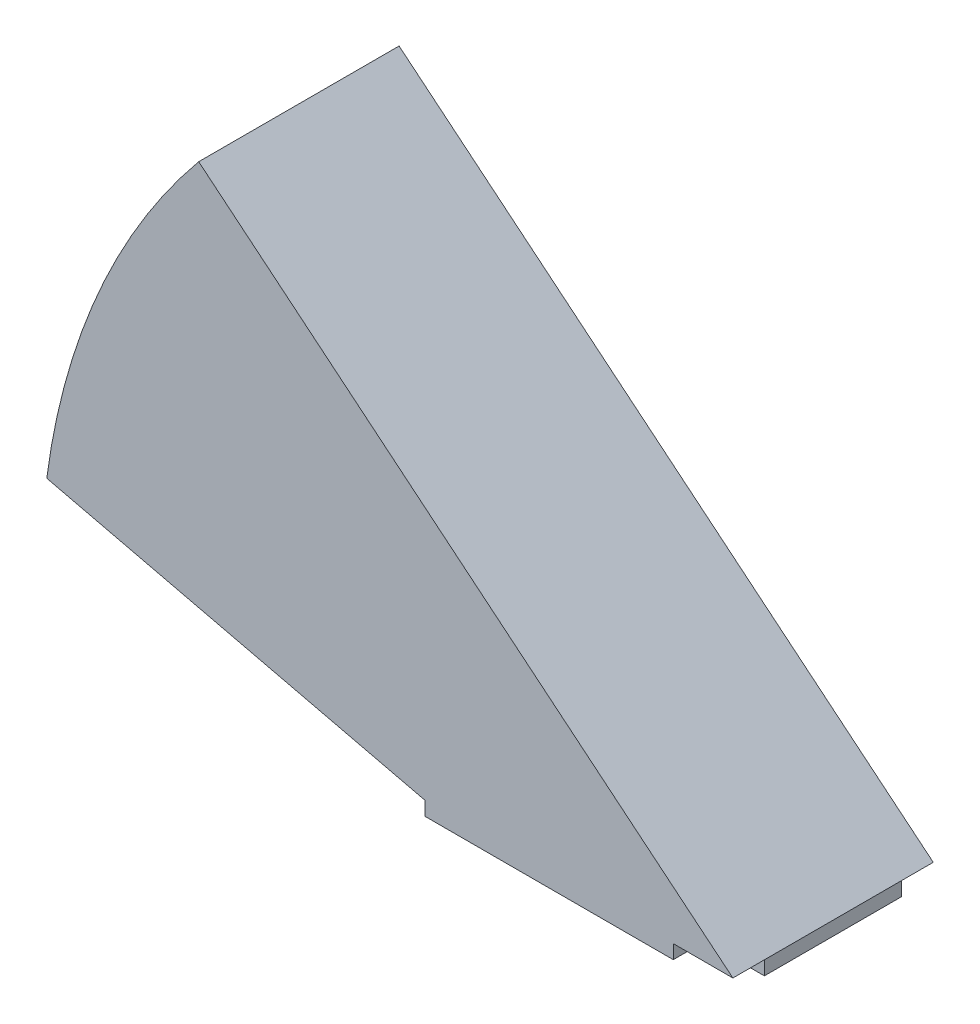
ISO-10303-21;
HEADER;
FILE_DESCRIPTION(('STEP AP214'),'2;1');
FILE_NAME('part.step','',(''),(''),'','','');
FILE_SCHEMA(('AUTOMOTIVE_DESIGN { 1 0 10303 214 1 1 1 1 }'));
ENDSEC;
DATA;
#1=APPLICATION_CONTEXT('core data for automotive mechanical design processes');
#2=APPLICATION_PROTOCOL_DEFINITION('international standard','automotive_design',2000,#1);
#3=PRODUCT_CONTEXT('',#1,'mechanical');
#4=PRODUCT('Part','Part','',(#3));
#5=PRODUCT_RELATED_PRODUCT_CATEGORY('part','',(#4));
#6=PRODUCT_DEFINITION_FORMATION('','',#4);
#7=PRODUCT_DEFINITION_CONTEXT('part definition',#1,'design');
#8=PRODUCT_DEFINITION('design','',#6,#7);
#9=PRODUCT_DEFINITION_SHAPE('','',#8);
#10=(LENGTH_UNIT() NAMED_UNIT(*) SI_UNIT(.MILLI.,.METRE.));
#11=(NAMED_UNIT(*) PLANE_ANGLE_UNIT() SI_UNIT($,.RADIAN.));
#12=(NAMED_UNIT(*) SI_UNIT($,.STERADIAN.) SOLID_ANGLE_UNIT());
#13=UNCERTAINTY_MEASURE_WITH_UNIT(LENGTH_MEASURE(1.E-05),#10,'distance_accuracy_value','');
#14=(GEOMETRIC_REPRESENTATION_CONTEXT(3) GLOBAL_UNCERTAINTY_ASSIGNED_CONTEXT((#13)) GLOBAL_UNIT_ASSIGNED_CONTEXT((#10,
#11,#12)) REPRESENTATION_CONTEXT('',''));
#15=CARTESIAN_POINT('',(0.,0.,0.));
#16=DIRECTION('',(0.,0.,1.));
#17=DIRECTION('',(1.,0.,0.));
#18=AXIS2_PLACEMENT_3D('',#15,#16,#17);
#19=CARTESIAN_POINT('',(71.3,4.,0.));
#20=DIRECTION('',(-1.,0.,0.));
#21=DIRECTION('',(0.,0.,1.));
#22=AXIS2_PLACEMENT_3D('',#19,#20,#21);
#23=PLANE('',#22);
#24=DIRECTION('',(0.,0.,-1.));
#25=VECTOR('',#24,1.);
#26=CARTESIAN_POINT('',(71.3,0.,0.));
#27=LINE('',#26,#25);
#28=CARTESIAN_POINT('',(71.3,0.,0.));
#29=VERTEX_POINT('',#28);
#30=CARTESIAN_POINT('',(71.3,0.,-9.05));
#31=VERTEX_POINT('',#30);
#32=EDGE_CURVE('E195',#29,#31,#27,.T.);
#33=ORIENTED_EDGE('',*,*,#32,.T.);
#34=DIRECTION('',(0.,-1.,0.));
#35=VECTOR('',#34,1.);
#36=CARTESIAN_POINT('',(71.3,4.,-9.05));
#37=LINE('',#36,#35);
#38=CARTESIAN_POINT('',(71.3,4.,-9.05));
#39=VERTEX_POINT('',#38);
#40=EDGE_CURVE('E11',#39,#31,#37,.T.);
#41=ORIENTED_EDGE('',*,*,#40,.F.);
#42=DIRECTION('',(0.,0.,-1.));
#43=VECTOR('',#42,1.);
#44=CARTESIAN_POINT('',(71.3,4.,0.));
#45=LINE('',#44,#43);
#46=CARTESIAN_POINT('',(71.3,4.,0.));
#47=VERTEX_POINT('',#46);
#48=EDGE_CURVE('E176',#47,#39,#45,.T.);
#49=ORIENTED_EDGE('',*,*,#48,.F.);
#50=DIRECTION('',(0.,-1.,0.));
#51=VECTOR('',#50,1.);
#52=CARTESIAN_POINT('',(71.3,4.,0.));
#53=LINE('',#52,#51);
#54=EDGE_CURVE('E65',#47,#29,#53,.T.);
#55=ORIENTED_EDGE('',*,*,#54,.T.);
#56=EDGE_LOOP('',(#33,#41,#49,#55));
#57=FACE_BOUND('',#56,.T.);
#58=ADVANCED_FACE('F47',(#57),#23,.F.);
#59=CARTESIAN_POINT('',(0.,4.,-9.05));
#60=DIRECTION('',(0.,0.,-1.));
#61=DIRECTION('',(-1.,0.,0.));
#62=AXIS2_PLACEMENT_3D('',#59,#60,#61);
#63=PLANE('',#62);
#64=DIRECTION('',(1.,0.,0.));
#65=VECTOR('',#64,1.);
#66=CARTESIAN_POINT('',(0.,0.,-9.05));
#67=LINE('',#66,#65);
#68=CARTESIAN_POINT('',(88.4,0.,-9.05));
#69=VERTEX_POINT('',#68);
#70=EDGE_CURVE('E202',#31,#69,#67,.T.);
#71=ORIENTED_EDGE('',*,*,#70,.T.);
#72=DIRECTION('',(0.,-1.,0.));
#73=VECTOR('',#72,1.);
#74=CARTESIAN_POINT('',(88.4,4.,-9.05));
#75=LINE('',#74,#73);
#76=CARTESIAN_POINT('',(88.4,4.,-9.05));
#77=VERTEX_POINT('',#76);
#78=EDGE_CURVE('E57',#77,#69,#75,.T.);
#79=ORIENTED_EDGE('',*,*,#78,.F.);
#80=DIRECTION('',(1.,0.,0.));
#81=VECTOR('',#80,1.);
#82=CARTESIAN_POINT('',(0.,4.,-9.05));
#83=LINE('',#82,#81);
#84=EDGE_CURVE('E103',#39,#77,#83,.T.);
#85=ORIENTED_EDGE('',*,*,#84,.F.);
#86=ORIENTED_EDGE('',*,*,#40,.T.);
#87=EDGE_LOOP('',(#71,#79,#85,#86));
#88=FACE_BOUND('',#87,.T.);
#89=ADVANCED_FACE('F49',(#88),#63,.F.);
#90=CARTESIAN_POINT('',(88.4,4.,0.));
#91=DIRECTION('',(1.,0.,0.));
#92=DIRECTION('',(0.,0.,-1.));
#93=AXIS2_PLACEMENT_3D('',#90,#91,#92);
#94=PLANE('',#93);
#95=DIRECTION('',(0.,0.,1.));
#96=VECTOR('',#95,1.);
#97=CARTESIAN_POINT('',(88.4,0.,0.));
#98=LINE('',#97,#96);
#99=CARTESIAN_POINT('',(88.4,0.,-48.45));
#100=VERTEX_POINT('',#99);
#101=EDGE_CURVE('E207',#100,#69,#98,.T.);
#102=ORIENTED_EDGE('',*,*,#101,.F.);
#103=DIRECTION('',(0.,-1.,0.));
#104=VECTOR('',#103,1.);
#105=CARTESIAN_POINT('',(88.4,4.,-48.45));
#106=LINE('',#105,#104);
#107=CARTESIAN_POINT('',(88.4,4.,-48.45));
#108=VERTEX_POINT('',#107);
#109=EDGE_CURVE('E238',#108,#100,#106,.T.);
#110=ORIENTED_EDGE('',*,*,#109,.F.);
#111=DIRECTION('',(0.,0.,1.));
#112=VECTOR('',#111,1.);
#113=CARTESIAN_POINT('',(88.4,4.,0.));
#114=LINE('',#113,#112);
#115=EDGE_CURVE('E183',#108,#77,#114,.T.);
#116=ORIENTED_EDGE('',*,*,#115,.T.);
#117=ORIENTED_EDGE('',*,*,#78,.T.);
#118=EDGE_LOOP('',(#102,#110,#116,#117));
#119=FACE_BOUND('',#118,.T.);
#120=ADVANCED_FACE('F243',(#119),#94,.T.);
#121=CARTESIAN_POINT('',(0.,4.,-48.45));
#122=DIRECTION('',(0.,0.,-1.));
#123=DIRECTION('',(-1.,0.,0.));
#124=AXIS2_PLACEMENT_3D('',#121,#122,#123);
#125=PLANE('',#124);
#126=DIRECTION('',(1.,0.,0.));
#127=VECTOR('',#126,1.);
#128=CARTESIAN_POINT('',(0.,0.,-48.45));
#129=LINE('',#128,#127);
#130=CARTESIAN_POINT('',(71.3,0.,-48.45));
#131=VERTEX_POINT('',#130);
#132=EDGE_CURVE('E211',#131,#100,#129,.T.);
#133=ORIENTED_EDGE('',*,*,#132,.F.);
#134=DIRECTION('',(0.,-1.,0.));
#135=VECTOR('',#134,1.);
#136=CARTESIAN_POINT('',(71.3,4.,-48.45));
#137=LINE('',#136,#135);
#138=CARTESIAN_POINT('',(71.3,4.,-48.45));
#139=VERTEX_POINT('',#138);
#140=EDGE_CURVE('E235',#139,#131,#137,.T.);
#141=ORIENTED_EDGE('',*,*,#140,.F.);
#142=DIRECTION('',(1.,0.,0.));
#143=VECTOR('',#142,1.);
#144=CARTESIAN_POINT('',(0.,4.,-48.45));
#145=LINE('',#144,#143);
#146=EDGE_CURVE('E187',#139,#108,#145,.T.);
#147=ORIENTED_EDGE('',*,*,#146,.T.);
#148=ORIENTED_EDGE('',*,*,#109,.T.);
#149=EDGE_LOOP('',(#133,#141,#147,#148));
#150=FACE_BOUND('',#149,.T.);
#151=ADVANCED_FACE('F253',(#150),#125,.T.);
#152=CARTESIAN_POINT('',(71.3,0.,-57.5));
#153=VERTEX_POINT('',#152);
#154=EDGE_CURVE('E203',#131,#153,#27,.T.);
#155=ORIENTED_EDGE('',*,*,#154,.T.);
#156=DIRECTION('',(0.,-1.,0.));
#157=VECTOR('',#156,1.);
#158=CARTESIAN_POINT('',(71.3,4.,-57.5));
#159=LINE('',#158,#157);
#160=CARTESIAN_POINT('',(71.3,4.,-57.5));
#161=VERTEX_POINT('',#160);
#162=EDGE_CURVE('E132',#161,#153,#159,.T.);
#163=ORIENTED_EDGE('',*,*,#162,.F.);
#164=EDGE_CURVE('E141',#139,#161,#45,.T.);
#165=ORIENTED_EDGE('',*,*,#164,.F.);
#166=ORIENTED_EDGE('',*,*,#140,.T.);
#167=EDGE_LOOP('',(#155,#163,#165,#166));
#168=FACE_BOUND('',#167,.T.);
#169=ADVANCED_FACE('F286',(#168),#23,.F.);
#170=CARTESIAN_POINT('',(0.,4.,-57.5));
#171=DIRECTION('',(0.,0.,-1.));
#172=DIRECTION('',(-1.,0.,0.));
#173=AXIS2_PLACEMENT_3D('',#170,#171,#172);
#174=PLANE('',#173);
#175=DIRECTION('',(1.,0.,0.));
#176=VECTOR('',#175,1.);
#177=CARTESIAN_POINT('',(0.,0.,-57.5));
#178=LINE('',#177,#176);
#179=CARTESIAN_POINT('',(0.,0.,-57.5));
#180=VERTEX_POINT('',#179);
#181=EDGE_CURVE('E127',#180,#153,#178,.T.);
#182=ORIENTED_EDGE('',*,*,#181,.F.);
#183=DIRECTION('',(0.,-1.,0.));
#184=VECTOR('',#183,1.);
#185=CARTESIAN_POINT('',(0.,4.,-57.5));
#186=LINE('',#185,#184);
#187=CARTESIAN_POINT('',(0.,4.,-57.5));
#188=VERTEX_POINT('',#187);
#189=EDGE_CURVE('E118',#188,#180,#186,.T.);
#190=ORIENTED_EDGE('',*,*,#189,.F.);
#191=DIRECTION('',(-0.972973897150185,0.230915126105635,0.));
#192=VECTOR('',#191,1.);
#193=CARTESIAN_POINT('',(0.898697560631704,3.78671281814248,-57.5));
#194=LINE('',#193,#192);
#195=CARTESIAN_POINT('',(-108.484737296256,29.7465969710746,-57.5));
#196=VERTEX_POINT('',#195);
#197=EDGE_CURVE('E124',#188,#196,#194,.T.);
#198=ORIENTED_EDGE('',*,*,#197,.T.);
#199=CARTESIAN_POINT('',(88.4,4.,-57.5));
#200=DIRECTION('',(0.,0.,-1.));
#201=DIRECTION('',(-1.,0.,0.));
#202=AXIS2_PLACEMENT_3D('',#199,#200,#201);
#203=CIRCLE('',#202,198.561041082602);
#204=CARTESIAN_POINT('',(-64.8786864319716,130.22254680324,-57.5));
#205=VERTEX_POINT('',#204);
#206=EDGE_CURVE('E157',#205,#196,#203,.F.);
#207=ORIENTED_EDGE('',*,*,#206,.F.);
#208=DIRECTION('',(-0.77194743538944,0.635686366847416,0.));
#209=VECTOR('',#208,1.);
#210=CARTESIAN_POINT('',(37.6850545208165,45.7629464890479,-57.5));
#211=LINE('',#210,#209);
#212=CARTESIAN_POINT('',(88.4,3.99999999999999,-57.5));
#213=VERTEX_POINT('',#212);
#214=EDGE_CURVE('E161',#213,#205,#211,.T.);
#215=ORIENTED_EDGE('',*,*,#214,.F.);
#216=DIRECTION('',(1.,0.,0.));
#217=VECTOR('',#216,1.);
#218=CARTESIAN_POINT('',(0.,4.,-57.5));
#219=LINE('',#218,#217);
#220=EDGE_CURVE('E155',#161,#213,#219,.T.);
#221=ORIENTED_EDGE('',*,*,#220,.F.);
#222=ORIENTED_EDGE('',*,*,#162,.T.);
#223=EDGE_LOOP('',(#182,#190,#198,#207,#215,#221,#222));
#224=FACE_BOUND('',#223,.T.);
#225=ADVANCED_FACE('F120',(#224),#174,.T.);
#226=CARTESIAN_POINT('',(0.,4.,0.));
#227=DIRECTION('',(-1.,0.,0.));
#228=DIRECTION('',(0.,0.,1.));
#229=AXIS2_PLACEMENT_3D('',#226,#227,#228);
#230=PLANE('',#229);
#231=DIRECTION('',(0.,0.,-1.));
#232=VECTOR('',#231,1.);
#233=CARTESIAN_POINT('',(0.,0.,0.));
#234=LINE('',#233,#232);
#235=CARTESIAN_POINT('',(0.,0.,0.));
#236=VERTEX_POINT('',#235);
#237=EDGE_CURVE('E217',#236,#180,#234,.T.);
#238=ORIENTED_EDGE('',*,*,#237,.F.);
#239=DIRECTION('',(0.,-1.,0.));
#240=VECTOR('',#239,1.);
#241=CARTESIAN_POINT('',(0.,4.,0.));
#242=LINE('',#241,#240);
#243=CARTESIAN_POINT('',(0.,4.,0.));
#244=VERTEX_POINT('',#243);
#245=EDGE_CURVE('E93',#244,#236,#242,.T.);
#246=ORIENTED_EDGE('',*,*,#245,.F.);
#247=DIRECTION('',(0.,0.,-1.));
#248=VECTOR('',#247,1.);
#249=CARTESIAN_POINT('',(0.,4.,0.));
#250=LINE('',#249,#248);
#251=EDGE_CURVE('E135',#244,#188,#250,.T.);
#252=ORIENTED_EDGE('',*,*,#251,.T.);
#253=ORIENTED_EDGE('',*,*,#189,.T.);
#254=EDGE_LOOP('',(#238,#246,#252,#253));
#255=FACE_BOUND('',#254,.T.);
#256=ADVANCED_FACE('F136',(#255),#230,.T.);
#257=CARTESIAN_POINT('',(31.9771321754663,4.,-49.7748701258488));
#258=DIRECTION('',(0.,-1.,0.));
#259=DIRECTION('',(0.,0.,-1.));
#260=AXIS2_PLACEMENT_3D('',#257,#258,#259);
#261=CYLINDRICAL_SURFACE('',#260,4.56669303705034);
#262=CARTESIAN_POINT('',(31.9771321754663,4.,-49.7748701258488));
#263=DIRECTION('',(0.,1.,0.));
#264=DIRECTION('',(0.,0.,1.));
#265=AXIS2_PLACEMENT_3D('',#262,#263,#264);
#266=CIRCLE('',#265,4.56669303705034);
#267=CARTESIAN_POINT('',(31.9771321754663,4.,-45.2081770887985));
#268=VERTEX_POINT('',#267);
#269=EDGE_CURVE('E191',#268,#268,#266,.T.);
#270=ORIENTED_EDGE('',*,*,#269,.T.);
#271=EDGE_LOOP('',(#270));
#272=FACE_BOUND('',#271,.T.);
#273=CARTESIAN_POINT('',(31.9771321754663,0.,-49.7748701258488));
#274=DIRECTION('',(0.,1.,0.));
#275=DIRECTION('',(0.,0.,1.));
#276=AXIS2_PLACEMENT_3D('',#273,#274,#275);
#277=CIRCLE('',#276,4.56669303705034);
#278=CARTESIAN_POINT('',(31.9771321754663,0.,-45.2081770887985));
#279=VERTEX_POINT('',#278);
#280=EDGE_CURVE('E222',#279,#279,#277,.T.);
#281=ORIENTED_EDGE('',*,*,#280,.F.);
#282=EDGE_LOOP('',(#281));
#283=FACE_BOUND('',#282,.T.);
#284=ADVANCED_FACE('F369',(#272,#283),#261,.F.);
#285=CARTESIAN_POINT('',(0.,4.,0.));
#286=DIRECTION('',(0.,0.,-1.));
#287=DIRECTION('',(-1.,0.,0.));
#288=AXIS2_PLACEMENT_3D('',#285,#286,#287);
#289=PLANE('',#288);
#290=DIRECTION('',(1.,0.,0.));
#291=VECTOR('',#290,1.);
#292=CARTESIAN_POINT('',(0.,0.,0.));
#293=LINE('',#292,#291);
#294=EDGE_CURVE('E96',#236,#29,#293,.T.);
#295=ORIENTED_EDGE('',*,*,#294,.T.);
#296=ORIENTED_EDGE('',*,*,#54,.F.);
#297=DIRECTION('',(1.,0.,0.));
#298=VECTOR('',#297,1.);
#299=CARTESIAN_POINT('',(0.,4.,0.));
#300=LINE('',#299,#298);
#301=CARTESIAN_POINT('',(88.4,3.99999999999999,0.));
#302=VERTEX_POINT('',#301);
#303=EDGE_CURVE('E148',#47,#302,#300,.T.);
#304=ORIENTED_EDGE('',*,*,#303,.T.);
#305=DIRECTION('',(-0.771947435389439,0.635686366847416,0.));
#306=VECTOR('',#305,1.);
#307=CARTESIAN_POINT('',(37.6850545208165,45.7629464890479,0.));
#308=LINE('',#307,#306);
#309=CARTESIAN_POINT('',(-64.8786864319716,130.22254680324,0.));
#310=VERTEX_POINT('',#309);
#311=EDGE_CURVE('E151',#302,#310,#308,.T.);
#312=ORIENTED_EDGE('',*,*,#311,.T.);
#313=CARTESIAN_POINT('',(88.4,4.,0.));
#314=DIRECTION('',(0.,0.,1.));
#315=DIRECTION('',(1.,0.,0.));
#316=AXIS2_PLACEMENT_3D('',#313,#314,#315);
#317=CIRCLE('',#316,198.561041082602);
#318=CARTESIAN_POINT('',(-108.484737296256,29.7465969710746,0.));
#319=VERTEX_POINT('',#318);
#320=EDGE_CURVE('E273',#310,#319,#317,.T.);
#321=ORIENTED_EDGE('',*,*,#320,.T.);
#322=DIRECTION('',(-0.972973897150185,0.230915126105635,0.));
#323=VECTOR('',#322,1.);
#324=CARTESIAN_POINT('',(0.898697560631704,3.78671281814248,0.));
#325=LINE('',#324,#323);
#326=EDGE_CURVE('E168',#244,#319,#325,.T.);
#327=ORIENTED_EDGE('',*,*,#326,.F.);
#328=ORIENTED_EDGE('',*,*,#245,.T.);
#329=EDGE_LOOP('',(#295,#296,#304,#312,#321,#327,#328));
#330=FACE_BOUND('',#329,.T.);
#331=ADVANCED_FACE('F292',(#330),#289,.F.);
#332=CARTESIAN_POINT('',(31.9771321754663,4.,-7.7251298741512));
#333=DIRECTION('',(0.,-1.,0.));
#334=DIRECTION('',(0.,0.,-1.));
#335=AXIS2_PLACEMENT_3D('',#332,#333,#334);
#336=CYLINDRICAL_SURFACE('',#335,4.56669303705034);
#337=CARTESIAN_POINT('',(31.9771321754663,4.,-7.7251298741512));
#338=DIRECTION('',(0.,1.,0.));
#339=DIRECTION('',(0.,0.,1.));
#340=AXIS2_PLACEMENT_3D('',#337,#338,#339);
#341=CIRCLE('',#340,4.56669303705034);
#342=CARTESIAN_POINT('',(31.9771321754663,4.,-3.15843683710086));
#343=VERTEX_POINT('',#342);
#344=EDGE_CURVE('E140',#343,#343,#341,.F.);
#345=ORIENTED_EDGE('',*,*,#344,.F.);
#346=EDGE_LOOP('',(#345));
#347=FACE_BOUND('',#346,.T.);
#348=CARTESIAN_POINT('',(31.9771321754663,0.,-7.7251298741512));
#349=DIRECTION('',(0.,1.,0.));
#350=DIRECTION('',(0.,0.,1.));
#351=AXIS2_PLACEMENT_3D('',#348,#349,#350);
#352=CIRCLE('',#351,4.56669303705034);
#353=CARTESIAN_POINT('',(31.9771321754663,0.,-3.15843683710086));
#354=VERTEX_POINT('',#353);
#355=EDGE_CURVE('E180',#354,#354,#352,.F.);
#356=ORIENTED_EDGE('',*,*,#355,.T.);
#357=EDGE_LOOP('',(#356));
#358=FACE_BOUND('',#357,.T.);
#359=ADVANCED_FACE('F385',(#347,#358),#336,.F.);
#360=CARTESIAN_POINT('',(0.,0.,0.));
#361=DIRECTION('',(0.,1.,0.));
#362=DIRECTION('',(0.,0.,1.));
#363=AXIS2_PLACEMENT_3D('',#360,#361,#362);
#364=PLANE('',#363);
#365=ORIENTED_EDGE('',*,*,#32,.F.);
#366=ORIENTED_EDGE('',*,*,#294,.F.);
#367=ORIENTED_EDGE('',*,*,#237,.T.);
#368=ORIENTED_EDGE('',*,*,#181,.T.);
#369=ORIENTED_EDGE('',*,*,#154,.F.);
#370=ORIENTED_EDGE('',*,*,#132,.T.);
#371=ORIENTED_EDGE('',*,*,#101,.T.);
#372=ORIENTED_EDGE('',*,*,#70,.F.);
#373=EDGE_LOOP('',(#365,#366,#367,#368,#369,#370,#371,#372));
#374=FACE_BOUND('',#373,.T.);
#375=ORIENTED_EDGE('',*,*,#280,.T.);
#376=EDGE_LOOP('',(#375));
#377=FACE_BOUND('',#376,.T.);
#378=ORIENTED_EDGE('',*,*,#355,.F.);
#379=EDGE_LOOP('',(#378));
#380=FACE_BOUND('',#379,.T.);
#381=ADVANCED_FACE('F247',(#374,#377,#380),#364,.F.);
#382=CARTESIAN_POINT('',(0.,4.,-291.37118484694));
#383=DIRECTION('',(0.,-1.,0.));
#384=DIRECTION('',(0.,0.,-1.));
#385=AXIS2_PLACEMENT_3D('',#382,#383,#384);
#386=PLANE('',#385);
#387=ORIENTED_EDGE('',*,*,#344,.T.);
#388=EDGE_LOOP('',(#387));
#389=FACE_BOUND('',#388,.T.);
#390=ADVANCED_FACE('F401',(#389),#386,.T.);
#391=ORIENTED_EDGE('',*,*,#269,.F.);
#392=EDGE_LOOP('',(#391));
#393=FACE_BOUND('',#392,.T.);
#394=ADVANCED_FACE('F410',(#393),#386,.T.);
#395=ORIENTED_EDGE('',*,*,#303,.F.);
#396=ORIENTED_EDGE('',*,*,#48,.T.);
#397=ORIENTED_EDGE('',*,*,#84,.T.);
#398=DIRECTION('',(0.,0.,1.));
#399=VECTOR('',#398,1.);
#400=CARTESIAN_POINT('',(88.4,3.99999999999999,-291.37118484694));
#401=LINE('',#400,#399);
#402=EDGE_CURVE('E175',#77,#302,#401,.T.);
#403=ORIENTED_EDGE('',*,*,#402,.T.);
#404=EDGE_LOOP('',(#395,#396,#397,#403));
#405=FACE_BOUND('',#404,.T.);
#406=ADVANCED_FACE('F291',(#405),#386,.T.);
#407=ORIENTED_EDGE('',*,*,#146,.F.);
#408=ORIENTED_EDGE('',*,*,#164,.T.);
#409=ORIENTED_EDGE('',*,*,#220,.T.);
#410=EDGE_CURVE('E165',#213,#108,#401,.T.);
#411=ORIENTED_EDGE('',*,*,#410,.T.);
#412=EDGE_LOOP('',(#407,#408,#409,#411));
#413=FACE_BOUND('',#412,.T.);
#414=ADVANCED_FACE('F266',(#413),#386,.T.);
#415=CARTESIAN_POINT('',(37.6850545208165,45.7629464890479,-291.37118484694));
#416=DIRECTION('',(0.635686366847416,0.77194743538944,0.));
#417=DIRECTION('',(-0.77194743538944,0.635686366847416,0.));
#418=AXIS2_PLACEMENT_3D('',#415,#416,#417);
#419=PLANE('',#418);
#420=ORIENTED_EDGE('',*,*,#410,.F.);
#421=ORIENTED_EDGE('',*,*,#214,.T.);
#422=DIRECTION('',(0.,0.,1.));
#423=VECTOR('',#422,1.);
#424=CARTESIAN_POINT('',(-64.8786864319716,130.22254680324,-291.37118484694));
#425=LINE('',#424,#423);
#426=EDGE_CURVE('E160',#205,#310,#425,.T.);
#427=ORIENTED_EDGE('',*,*,#426,.T.);
#428=ORIENTED_EDGE('',*,*,#311,.F.);
#429=ORIENTED_EDGE('',*,*,#402,.F.);
#430=ORIENTED_EDGE('',*,*,#115,.F.);
#431=EDGE_LOOP('',(#420,#421,#427,#428,#429,#430));
#432=FACE_BOUND('',#431,.T.);
#433=ADVANCED_FACE('F261',(#432),#419,.T.);
#434=CARTESIAN_POINT('',(88.4,4.,-291.37118484694));
#435=DIRECTION('',(0.,0.,1.));
#436=DIRECTION('',(1.,0.,0.));
#437=AXIS2_PLACEMENT_3D('',#434,#435,#436);
#438=CYLINDRICAL_SURFACE('',#437,198.561041082602);
#439=ORIENTED_EDGE('',*,*,#426,.F.);
#440=ORIENTED_EDGE('',*,*,#206,.T.);
#441=DIRECTION('',(0.,0.,1.));
#442=VECTOR('',#441,1.);
#443=CARTESIAN_POINT('',(-108.484737296256,29.7465969710746,-291.37118484694));
#444=LINE('',#443,#442);
#445=EDGE_CURVE('E145',#196,#319,#444,.T.);
#446=ORIENTED_EDGE('',*,*,#445,.T.);
#447=ORIENTED_EDGE('',*,*,#320,.F.);
#448=EDGE_LOOP('',(#439,#440,#446,#447));
#449=FACE_BOUND('',#448,.T.);
#450=ADVANCED_FACE('F296',(#449),#438,.T.);
#451=CARTESIAN_POINT('',(0.898697560631704,3.78671281814248,-291.37118484694));
#452=DIRECTION('',(0.230915126105635,0.972973897150185,0.));
#453=DIRECTION('',(-0.972973897150185,0.230915126105635,0.));
#454=AXIS2_PLACEMENT_3D('',#451,#452,#453);
#455=PLANE('',#454);
#456=ORIENTED_EDGE('',*,*,#197,.F.);
#457=ORIENTED_EDGE('',*,*,#251,.F.);
#458=ORIENTED_EDGE('',*,*,#326,.T.);
#459=ORIENTED_EDGE('',*,*,#445,.F.);
#460=EDGE_LOOP('',(#456,#457,#458,#459));
#461=FACE_BOUND('',#460,.T.);
#462=ADVANCED_FACE('F143',(#461),#455,.F.);
#463=CLOSED_SHELL('',(#58,#89,#120,#151,#169,#225,#256,#284,#331,#359,#381,#390,#394,#406,#414,
#433,#450,#462));
#464=MANIFOLD_SOLID_BREP('B2',#463);
#465=ADVANCED_BREP_SHAPE_REPRESENTATION('',(#18,#464),#14);
#466=SHAPE_DEFINITION_REPRESENTATION(#9,#465);
ENDSEC;
END-ISO-10303-21;
